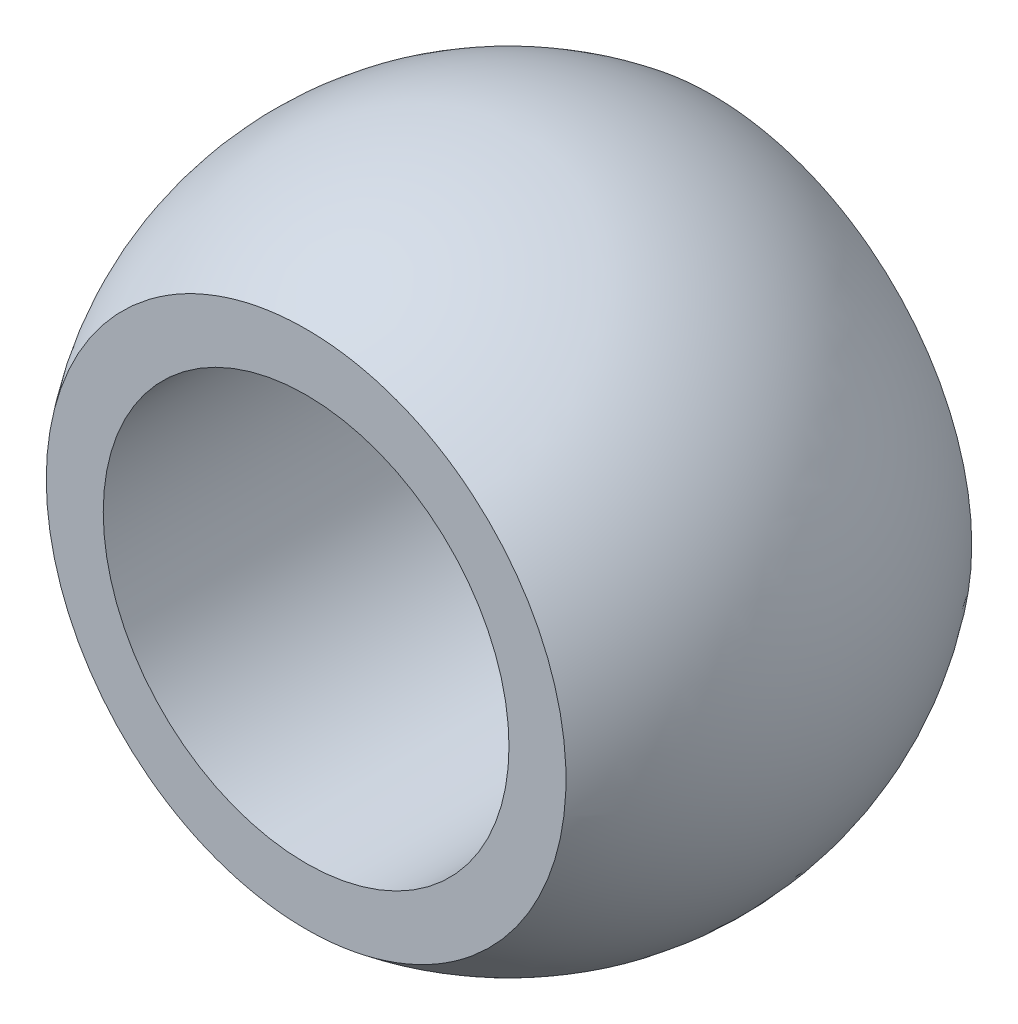
ISO-10303-21;
HEADER;
FILE_DESCRIPTION(('STEP AP214'),'2;1');
FILE_NAME('part.step','',(''),(''),'','','');
FILE_SCHEMA(('AUTOMOTIVE_DESIGN { 1 0 10303 214 1 1 1 1 }'));
ENDSEC;
DATA;
#1=APPLICATION_CONTEXT('core data for automotive mechanical design processes');
#2=APPLICATION_PROTOCOL_DEFINITION('international standard','automotive_design',2000,#1);
#3=PRODUCT_CONTEXT('',#1,'mechanical');
#4=PRODUCT('Part','Part','',(#3));
#5=PRODUCT_RELATED_PRODUCT_CATEGORY('part','',(#4));
#6=PRODUCT_DEFINITION_FORMATION('','',#4);
#7=PRODUCT_DEFINITION_CONTEXT('part definition',#1,'design');
#8=PRODUCT_DEFINITION('design','',#6,#7);
#9=PRODUCT_DEFINITION_SHAPE('','',#8);
#10=(LENGTH_UNIT() NAMED_UNIT(*) SI_UNIT(.MILLI.,.METRE.));
#11=(NAMED_UNIT(*) PLANE_ANGLE_UNIT() SI_UNIT($,.RADIAN.));
#12=(NAMED_UNIT(*) SI_UNIT($,.STERADIAN.) SOLID_ANGLE_UNIT());
#13=UNCERTAINTY_MEASURE_WITH_UNIT(LENGTH_MEASURE(1.E-05),#10,'distance_accuracy_value','');
#14=(GEOMETRIC_REPRESENTATION_CONTEXT(3) GLOBAL_UNCERTAINTY_ASSIGNED_CONTEXT((#13)) GLOBAL_UNIT_ASSIGNED_CONTEXT((#10,
#11,#12)) REPRESENTATION_CONTEXT('',''));
#15=CARTESIAN_POINT('',(0.,0.,0.));
#16=DIRECTION('',(0.,0.,1.));
#17=DIRECTION('',(1.,0.,0.));
#18=AXIS2_PLACEMENT_3D('',#15,#16,#17);
#19=CARTESIAN_POINT('',(0.,0.,17.5));
#20=DIRECTION('',(0.,0.,-1.));
#21=DIRECTION('',(1.,0.,0.));
#22=AXIS2_PLACEMENT_3D('',#19,#20,#21);
#23=CYLINDRICAL_SURFACE('',#22,4.);
#24=CARTESIAN_POINT('',(0.,0.,4.));
#25=DIRECTION('',(0.,0.,-1.));
#26=DIRECTION('',(-1.,0.,0.));
#27=AXIS2_PLACEMENT_3D('',#24,#25,#26);
#28=CIRCLE('',#27,4.);
#29=CARTESIAN_POINT('',(-4.,0.,4.));
#30=VERTEX_POINT('',#29);
#31=EDGE_CURVE('E75',#30,#30,#28,.F.);
#32=ORIENTED_EDGE('',*,*,#31,.T.);
#33=EDGE_LOOP('',(#32));
#34=FACE_BOUND('',#33,.T.);
#35=CARTESIAN_POINT('',(0.,0.,-4.));
#36=DIRECTION('',(0.,0.,1.));
#37=DIRECTION('',(1.,0.,0.));
#38=AXIS2_PLACEMENT_3D('',#35,#36,#37);
#39=CIRCLE('',#38,4.);
#40=CARTESIAN_POINT('',(4.,0.,-4.));
#41=VERTEX_POINT('',#40);
#42=EDGE_CURVE('E48',#41,#41,#39,.F.);
#43=ORIENTED_EDGE('',*,*,#42,.T.);
#44=EDGE_LOOP('',(#43));
#45=FACE_BOUND('',#44,.T.);
#46=ADVANCED_FACE('F44',(#34,#45),#23,.F.);
#47=CARTESIAN_POINT('',(-6.5,-13.5,4.));
#48=DIRECTION('',(0.,0.,1.));
#49=DIRECTION('',(-1.,0.,0.));
#50=AXIS2_PLACEMENT_3D('',#47,#48,#49);
#51=PLANE('',#50);
#52=CARTESIAN_POINT('',(0.,0.,4.));
#53=DIRECTION('',(0.,0.,-1.));
#54=DIRECTION('',(-1.,0.,0.));
#55=AXIS2_PLACEMENT_3D('',#52,#53,#54);
#56=CIRCLE('',#55,5.1234753829798);
#57=CARTESIAN_POINT('',(-5.1234753829798,0.,4.));
#58=VERTEX_POINT('',#57);
#59=EDGE_CURVE('E65',#58,#58,#56,.F.);
#60=ORIENTED_EDGE('',*,*,#59,.T.);
#61=EDGE_LOOP('',(#60));
#62=FACE_BOUND('',#61,.T.);
#63=ORIENTED_EDGE('',*,*,#31,.F.);
#64=EDGE_LOOP('',(#63));
#65=FACE_BOUND('',#64,.T.);
#66=ADVANCED_FACE('F70',(#62,#65),#51,.T.);
#67=CARTESIAN_POINT('',(-6.5,-13.5,-4.));
#68=DIRECTION('',(0.,0.,-1.));
#69=DIRECTION('',(1.,0.,0.));
#70=AXIS2_PLACEMENT_3D('',#67,#68,#69);
#71=PLANE('',#70);
#72=CARTESIAN_POINT('',(0.,0.,-4.));
#73=DIRECTION('',(0.,0.,1.));
#74=DIRECTION('',(1.,0.,0.));
#75=AXIS2_PLACEMENT_3D('',#72,#73,#74);
#76=CIRCLE('',#75,5.1234753829798);
#77=CARTESIAN_POINT('',(5.1234753829798,0.,-4.));
#78=VERTEX_POINT('',#77);
#79=EDGE_CURVE('E12',#78,#78,#76,.F.);
#80=ORIENTED_EDGE('',*,*,#79,.T.);
#81=EDGE_LOOP('',(#80));
#82=FACE_BOUND('',#81,.T.);
#83=ORIENTED_EDGE('',*,*,#42,.F.);
#84=EDGE_LOOP('',(#83));
#85=FACE_BOUND('',#84,.T.);
#86=ADVANCED_FACE('F61',(#82,#85),#71,.T.);
#87=CARTESIAN_POINT('',(0.,0.,0.));
#88=DIRECTION('',(0.,-1.,0.));
#89=DIRECTION('',(-1.,0.,0.));
#90=AXIS2_PLACEMENT_3D('',#87,#88,#89);
#91=SPHERICAL_SURFACE('',#90,6.5);
#92=CARTESIAN_POINT('',(6.5,0.,0.));
#93=VERTEX_POINT('',#92);
#94=VERTEX_LOOP('',#93);
#95=FACE_BOUND('',#94,.T.);
#96=CARTESIAN_POINT('',(-6.5,0.,0.));
#97=VERTEX_POINT('',#96);
#98=VERTEX_LOOP('',#97);
#99=FACE_BOUND('',#98,.T.);
#100=ORIENTED_EDGE('',*,*,#59,.F.);
#101=EDGE_LOOP('',(#100));
#102=FACE_BOUND('',#101,.T.);
#103=ORIENTED_EDGE('',*,*,#79,.F.);
#104=EDGE_LOOP('',(#103));
#105=FACE_BOUND('',#104,.T.);
#106=ADVANCED_FACE('F46',(#95,#99,#102,#105),#91,.T.);
#107=CLOSED_SHELL('',(#46,#66,#86,#106));
#108=MANIFOLD_SOLID_BREP('B2',#107);
#109=ADVANCED_BREP_SHAPE_REPRESENTATION('',(#18,#108),#14);
#110=SHAPE_DEFINITION_REPRESENTATION(#9,#109);
ENDSEC;
END-ISO-10303-21;
